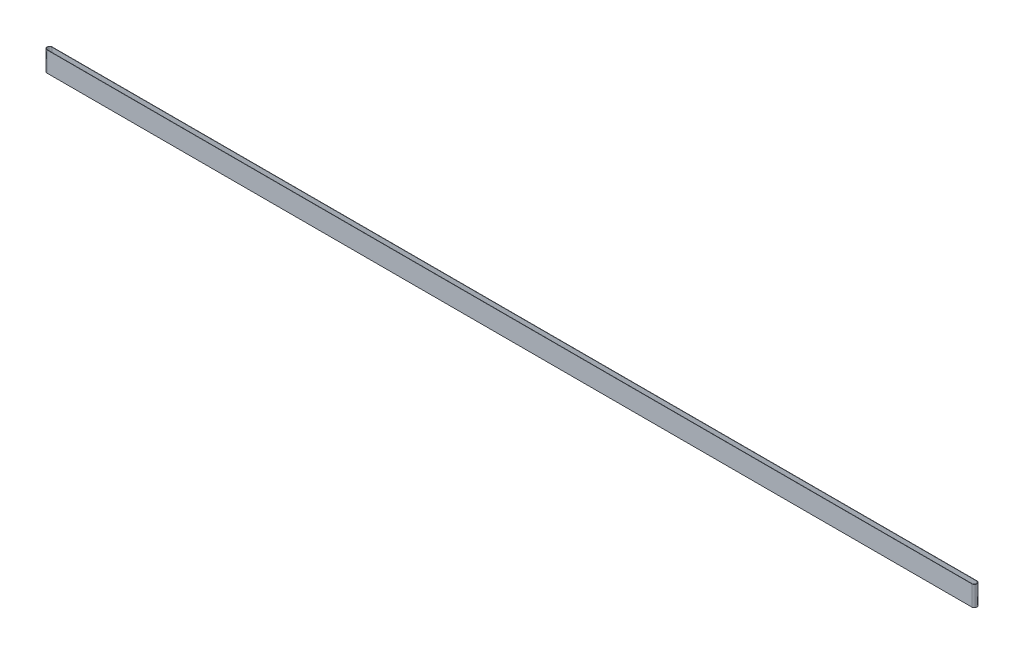
ISO-10303-21;
HEADER;
FILE_DESCRIPTION(('STEP AP214'),'2;1');
FILE_NAME('part.step','',(''),(''),'','','');
FILE_SCHEMA(('AUTOMOTIVE_DESIGN { 1 0 10303 214 1 1 1 1 }'));
ENDSEC;
DATA;
#1=APPLICATION_CONTEXT('core data for automotive mechanical design processes');
#2=APPLICATION_PROTOCOL_DEFINITION('international standard','automotive_design',2000,#1);
#3=PRODUCT_CONTEXT('',#1,'mechanical');
#4=PRODUCT('Part','Part','',(#3));
#5=PRODUCT_RELATED_PRODUCT_CATEGORY('part','',(#4));
#6=PRODUCT_DEFINITION_FORMATION('','',#4);
#7=PRODUCT_DEFINITION_CONTEXT('part definition',#1,'design');
#8=PRODUCT_DEFINITION('design','',#6,#7);
#9=PRODUCT_DEFINITION_SHAPE('','',#8);
#10=(LENGTH_UNIT() NAMED_UNIT(*) SI_UNIT(.MILLI.,.METRE.));
#11=(NAMED_UNIT(*) PLANE_ANGLE_UNIT() SI_UNIT($,.RADIAN.));
#12=(NAMED_UNIT(*) SI_UNIT($,.STERADIAN.) SOLID_ANGLE_UNIT());
#13=UNCERTAINTY_MEASURE_WITH_UNIT(LENGTH_MEASURE(1.E-05),#10,'distance_accuracy_value','');
#14=(GEOMETRIC_REPRESENTATION_CONTEXT(3) GLOBAL_UNCERTAINTY_ASSIGNED_CONTEXT((#13)) GLOBAL_UNIT_ASSIGNED_CONTEXT((#10,
#11,#12)) REPRESENTATION_CONTEXT('',''));
#15=CARTESIAN_POINT('',(0.,0.,0.));
#16=DIRECTION('',(0.,0.,1.));
#17=DIRECTION('',(1.,0.,0.));
#18=AXIS2_PLACEMENT_3D('',#15,#16,#17);
#19=CARTESIAN_POINT('',(0.,39.,0.));
#20=DIRECTION('',(0.,1.,0.));
#21=DIRECTION('',(0.,0.,1.));
#22=AXIS2_PLACEMENT_3D('',#19,#20,#21);
#23=PLANE('',#22);
#24=CARTESIAN_POINT('',(0.,39.,0.));
#25=DIRECTION('',(0.,1.,0.));
#26=DIRECTION('',(0.,0.,1.));
#27=AXIS2_PLACEMENT_3D('',#24,#25,#26);
#28=CIRCLE('',#27,5.);
#29=CARTESIAN_POINT('',(0.,39.,-5.));
#30=VERTEX_POINT('',#29);
#31=CARTESIAN_POINT('',(0.,39.,5.));
#32=VERTEX_POINT('',#31);
#33=EDGE_CURVE('E136',#30,#32,#28,.T.);
#34=ORIENTED_EDGE('',*,*,#33,.T.);
#35=DIRECTION('',(1.,0.,0.));
#36=VECTOR('',#35,1.);
#37=CARTESIAN_POINT('',(1790.,39.,4.99999999999982));
#38=LINE('',#37,#36);
#39=CARTESIAN_POINT('',(1790.,39.,4.99999999999982));
#40=VERTEX_POINT('',#39);
#41=EDGE_CURVE('E139',#32,#40,#38,.T.);
#42=ORIENTED_EDGE('',*,*,#41,.T.);
#43=CARTESIAN_POINT('',(1790.,39.,0.));
#44=DIRECTION('',(0.,1.,0.));
#45=DIRECTION('',(0.,0.,1.));
#46=AXIS2_PLACEMENT_3D('',#43,#44,#45);
#47=CIRCLE('',#46,4.99999999999982);
#48=CARTESIAN_POINT('',(1790.,39.,-4.99999999999982));
#49=VERTEX_POINT('',#48);
#50=EDGE_CURVE('E142',#40,#49,#47,.T.);
#51=ORIENTED_EDGE('',*,*,#50,.T.);
#52=DIRECTION('',(-1.,0.,0.));
#53=VECTOR('',#52,1.);
#54=CARTESIAN_POINT('',(0.,39.,-5.));
#55=LINE('',#54,#53);
#56=EDGE_CURVE('E144',#49,#30,#55,.T.);
#57=ORIENTED_EDGE('',*,*,#56,.T.);
#58=EDGE_LOOP('',(#34,#42,#51,#57));
#59=FACE_BOUND('',#58,.T.);
#60=DIRECTION('',(1.,0.,0.));
#61=VECTOR('',#60,1.);
#62=CARTESIAN_POINT('',(1790.,39.,4.50000000000001));
#63=LINE('',#62,#61);
#64=CARTESIAN_POINT('',(0.,39.,4.5));
#65=VERTEX_POINT('',#64);
#66=CARTESIAN_POINT('',(1790.,39.,4.50000000000001));
#67=VERTEX_POINT('',#66);
#68=EDGE_CURVE('E108',#65,#67,#63,.T.);
#69=ORIENTED_EDGE('',*,*,#68,.F.);
#70=CARTESIAN_POINT('',(0.,39.,0.));
#71=DIRECTION('',(0.,1.,0.));
#72=DIRECTION('',(0.,0.,1.));
#73=AXIS2_PLACEMENT_3D('',#70,#71,#72);
#74=CIRCLE('',#73,4.5);
#75=CARTESIAN_POINT('',(0.,39.,-4.5));
#76=VERTEX_POINT('',#75);
#77=EDGE_CURVE('E100',#76,#65,#74,.T.);
#78=ORIENTED_EDGE('',*,*,#77,.F.);
#79=DIRECTION('',(-1.,0.,0.));
#80=VECTOR('',#79,1.);
#81=CARTESIAN_POINT('',(0.,39.,-4.5));
#82=LINE('',#81,#80);
#83=CARTESIAN_POINT('',(1790.,39.,-4.50000000000001));
#84=VERTEX_POINT('',#83);
#85=EDGE_CURVE('E122',#84,#76,#82,.T.);
#86=ORIENTED_EDGE('',*,*,#85,.F.);
#87=CARTESIAN_POINT('',(1790.,39.,0.));
#88=DIRECTION('',(0.,1.,0.));
#89=DIRECTION('',(0.,0.,1.));
#90=AXIS2_PLACEMENT_3D('',#87,#88,#89);
#91=CIRCLE('',#90,4.50000000000001);
#92=EDGE_CURVE('E120',#67,#84,#91,.T.);
#93=ORIENTED_EDGE('',*,*,#92,.F.);
#94=EDGE_LOOP('',(#69,#78,#86,#93));
#95=FACE_BOUND('',#94,.T.);
#96=ADVANCED_FACE('F35',(#59,#95),#23,.T.);
#97=CARTESIAN_POINT('',(0.,0.,0.));
#98=DIRECTION('',(0.,1.,0.));
#99=DIRECTION('',(0.,0.,1.));
#100=AXIS2_PLACEMENT_3D('',#97,#98,#99);
#101=PLANE('',#100);
#102=CARTESIAN_POINT('',(0.,0.,0.));
#103=DIRECTION('',(0.,1.,0.));
#104=DIRECTION('',(0.,0.,1.));
#105=AXIS2_PLACEMENT_3D('',#102,#103,#104);
#106=CIRCLE('',#105,5.);
#107=CARTESIAN_POINT('',(0.,0.,-5.));
#108=VERTEX_POINT('',#107);
#109=CARTESIAN_POINT('',(0.,0.,5.));
#110=VERTEX_POINT('',#109);
#111=EDGE_CURVE('E116',#108,#110,#106,.T.);
#112=ORIENTED_EDGE('',*,*,#111,.F.);
#113=DIRECTION('',(-1.,0.,0.));
#114=VECTOR('',#113,1.);
#115=CARTESIAN_POINT('',(0.,0.,-5.));
#116=LINE('',#115,#114);
#117=CARTESIAN_POINT('',(1790.,0.,-4.99999999999982));
#118=VERTEX_POINT('',#117);
#119=EDGE_CURVE('E140',#118,#108,#116,.T.);
#120=ORIENTED_EDGE('',*,*,#119,.F.);
#121=CARTESIAN_POINT('',(1790.,0.,0.));
#122=DIRECTION('',(0.,1.,0.));
#123=DIRECTION('',(0.,0.,1.));
#124=AXIS2_PLACEMENT_3D('',#121,#122,#123);
#125=CIRCLE('',#124,4.99999999999982);
#126=CARTESIAN_POINT('',(1790.,0.,4.99999999999982));
#127=VERTEX_POINT('',#126);
#128=EDGE_CURVE('E151',#127,#118,#125,.T.);
#129=ORIENTED_EDGE('',*,*,#128,.F.);
#130=DIRECTION('',(1.,0.,0.));
#131=VECTOR('',#130,1.);
#132=CARTESIAN_POINT('',(1790.,0.,4.99999999999982));
#133=LINE('',#132,#131);
#134=EDGE_CURVE('E149',#110,#127,#133,.T.);
#135=ORIENTED_EDGE('',*,*,#134,.F.);
#136=EDGE_LOOP('',(#112,#120,#129,#135));
#137=FACE_BOUND('',#136,.T.);
#138=CARTESIAN_POINT('',(0.,0.,0.));
#139=DIRECTION('',(0.,1.,0.));
#140=DIRECTION('',(0.,0.,1.));
#141=AXIS2_PLACEMENT_3D('',#138,#139,#140);
#142=CIRCLE('',#141,4.5);
#143=CARTESIAN_POINT('',(0.,0.,-4.5));
#144=VERTEX_POINT('',#143);
#145=CARTESIAN_POINT('',(0.,0.,4.5));
#146=VERTEX_POINT('',#145);
#147=EDGE_CURVE('E58',#144,#146,#142,.T.);
#148=ORIENTED_EDGE('',*,*,#147,.T.);
#149=DIRECTION('',(1.,0.,0.));
#150=VECTOR('',#149,1.);
#151=CARTESIAN_POINT('',(1790.,0.,4.50000000000001));
#152=LINE('',#151,#150);
#153=CARTESIAN_POINT('',(1790.,0.,4.50000000000001));
#154=VERTEX_POINT('',#153);
#155=EDGE_CURVE('E115',#146,#154,#152,.T.);
#156=ORIENTED_EDGE('',*,*,#155,.T.);
#157=CARTESIAN_POINT('',(1790.,0.,0.));
#158=DIRECTION('',(0.,1.,0.));
#159=DIRECTION('',(0.,0.,1.));
#160=AXIS2_PLACEMENT_3D('',#157,#158,#159);
#161=CIRCLE('',#160,4.50000000000001);
#162=CARTESIAN_POINT('',(1790.,0.,-4.50000000000001));
#163=VERTEX_POINT('',#162);
#164=EDGE_CURVE('E128',#154,#163,#161,.T.);
#165=ORIENTED_EDGE('',*,*,#164,.T.);
#166=DIRECTION('',(-1.,0.,0.));
#167=VECTOR('',#166,1.);
#168=CARTESIAN_POINT('',(0.,0.,-4.5));
#169=LINE('',#168,#167);
#170=EDGE_CURVE('E109',#163,#144,#169,.T.);
#171=ORIENTED_EDGE('',*,*,#170,.T.);
#172=EDGE_LOOP('',(#148,#156,#165,#171));
#173=FACE_BOUND('',#172,.T.);
#174=ADVANCED_FACE('F169',(#137,#173),#101,.F.);
#175=CARTESIAN_POINT('',(0.,39.,0.));
#176=DIRECTION('',(0.,-1.,0.));
#177=DIRECTION('',(0.,0.,-1.));
#178=AXIS2_PLACEMENT_3D('',#175,#176,#177);
#179=CYLINDRICAL_SURFACE('',#178,5.);
#180=ORIENTED_EDGE('',*,*,#111,.T.);
#181=DIRECTION('',(0.,-1.,0.));
#182=VECTOR('',#181,1.);
#183=CARTESIAN_POINT('',(0.,39.,5.));
#184=LINE('',#183,#182);
#185=EDGE_CURVE('E11',#32,#110,#184,.T.);
#186=ORIENTED_EDGE('',*,*,#185,.F.);
#187=ORIENTED_EDGE('',*,*,#33,.F.);
#188=DIRECTION('',(0.,-1.,0.));
#189=VECTOR('',#188,1.);
#190=CARTESIAN_POINT('',(0.,39.,-5.));
#191=LINE('',#190,#189);
#192=EDGE_CURVE('E146',#30,#108,#191,.T.);
#193=ORIENTED_EDGE('',*,*,#192,.T.);
#194=EDGE_LOOP('',(#180,#186,#187,#193));
#195=FACE_BOUND('',#194,.T.);
#196=ADVANCED_FACE('F37',(#195),#179,.T.);
#197=CARTESIAN_POINT('',(1790.,39.,4.99999999999982));
#198=DIRECTION('',(0.,0.,-1.));
#199=DIRECTION('',(-1.,0.,0.));
#200=AXIS2_PLACEMENT_3D('',#197,#198,#199);
#201=PLANE('',#200);
#202=ORIENTED_EDGE('',*,*,#134,.T.);
#203=DIRECTION('',(0.,-1.,0.));
#204=VECTOR('',#203,1.);
#205=CARTESIAN_POINT('',(1790.,39.,4.99999999999982));
#206=LINE('',#205,#204);
#207=EDGE_CURVE('E43',#40,#127,#206,.T.);
#208=ORIENTED_EDGE('',*,*,#207,.F.);
#209=ORIENTED_EDGE('',*,*,#41,.F.);
#210=ORIENTED_EDGE('',*,*,#185,.T.);
#211=EDGE_LOOP('',(#202,#208,#209,#210));
#212=FACE_BOUND('',#211,.T.);
#213=ADVANCED_FACE('F179',(#212),#201,.F.);
#214=CARTESIAN_POINT('',(1790.,39.,0.));
#215=DIRECTION('',(0.,-1.,0.));
#216=DIRECTION('',(0.,0.,-1.));
#217=AXIS2_PLACEMENT_3D('',#214,#215,#216);
#218=CYLINDRICAL_SURFACE('',#217,4.99999999999982);
#219=ORIENTED_EDGE('',*,*,#128,.T.);
#220=DIRECTION('',(0.,-1.,0.));
#221=VECTOR('',#220,1.);
#222=CARTESIAN_POINT('',(1790.,39.,-4.99999999999982));
#223=LINE('',#222,#221);
#224=EDGE_CURVE('E156',#49,#118,#223,.T.);
#225=ORIENTED_EDGE('',*,*,#224,.F.);
#226=ORIENTED_EDGE('',*,*,#50,.F.);
#227=ORIENTED_EDGE('',*,*,#207,.T.);
#228=EDGE_LOOP('',(#219,#225,#226,#227));
#229=FACE_BOUND('',#228,.T.);
#230=ADVANCED_FACE('F163',(#229),#218,.T.);
#231=CARTESIAN_POINT('',(0.,39.,-5.));
#232=DIRECTION('',(0.,0.,1.));
#233=DIRECTION('',(1.,0.,0.));
#234=AXIS2_PLACEMENT_3D('',#231,#232,#233);
#235=PLANE('',#234);
#236=ORIENTED_EDGE('',*,*,#119,.T.);
#237=ORIENTED_EDGE('',*,*,#192,.F.);
#238=ORIENTED_EDGE('',*,*,#56,.F.);
#239=ORIENTED_EDGE('',*,*,#224,.T.);
#240=EDGE_LOOP('',(#236,#237,#238,#239));
#241=FACE_BOUND('',#240,.T.);
#242=ADVANCED_FACE('F173',(#241),#235,.F.);
#243=CARTESIAN_POINT('',(0.,39.,0.));
#244=DIRECTION('',(0.,-1.,0.));
#245=DIRECTION('',(0.,0.,-1.));
#246=AXIS2_PLACEMENT_3D('',#243,#244,#245);
#247=CYLINDRICAL_SURFACE('',#246,4.5);
#248=ORIENTED_EDGE('',*,*,#147,.F.);
#249=DIRECTION('',(0.,-1.,0.));
#250=VECTOR('',#249,1.);
#251=CARTESIAN_POINT('',(0.,39.,-4.5));
#252=LINE('',#251,#250);
#253=EDGE_CURVE('E104',#76,#144,#252,.T.);
#254=ORIENTED_EDGE('',*,*,#253,.F.);
#255=ORIENTED_EDGE('',*,*,#77,.T.);
#256=DIRECTION('',(0.,-1.,0.));
#257=VECTOR('',#256,1.);
#258=CARTESIAN_POINT('',(0.,39.,4.5));
#259=LINE('',#258,#257);
#260=EDGE_CURVE('E103',#65,#146,#259,.T.);
#261=ORIENTED_EDGE('',*,*,#260,.T.);
#262=EDGE_LOOP('',(#248,#254,#255,#261));
#263=FACE_BOUND('',#262,.T.);
#264=ADVANCED_FACE('F102',(#263),#247,.F.);
#265=CARTESIAN_POINT('',(1790.,39.,4.50000000000001));
#266=DIRECTION('',(0.,0.,-1.));
#267=DIRECTION('',(-1.,0.,0.));
#268=AXIS2_PLACEMENT_3D('',#265,#266,#267);
#269=PLANE('',#268);
#270=ORIENTED_EDGE('',*,*,#155,.F.);
#271=ORIENTED_EDGE('',*,*,#260,.F.);
#272=ORIENTED_EDGE('',*,*,#68,.T.);
#273=DIRECTION('',(0.,-1.,0.));
#274=VECTOR('',#273,1.);
#275=CARTESIAN_POINT('',(1790.,39.,4.50000000000001));
#276=LINE('',#275,#274);
#277=EDGE_CURVE('E117',#67,#154,#276,.T.);
#278=ORIENTED_EDGE('',*,*,#277,.T.);
#279=EDGE_LOOP('',(#270,#271,#272,#278));
#280=FACE_BOUND('',#279,.T.);
#281=ADVANCED_FACE('F112',(#280),#269,.T.);
#282=CARTESIAN_POINT('',(1790.,39.,0.));
#283=DIRECTION('',(0.,-1.,0.));
#284=DIRECTION('',(0.,0.,-1.));
#285=AXIS2_PLACEMENT_3D('',#282,#283,#284);
#286=CYLINDRICAL_SURFACE('',#285,4.50000000000001);
#287=ORIENTED_EDGE('',*,*,#164,.F.);
#288=ORIENTED_EDGE('',*,*,#277,.F.);
#289=ORIENTED_EDGE('',*,*,#92,.T.);
#290=DIRECTION('',(0.,-1.,0.));
#291=VECTOR('',#290,1.);
#292=CARTESIAN_POINT('',(1790.,39.,-4.50000000000001));
#293=LINE('',#292,#291);
#294=EDGE_CURVE('E50',#84,#163,#293,.T.);
#295=ORIENTED_EDGE('',*,*,#294,.T.);
#296=EDGE_LOOP('',(#287,#288,#289,#295));
#297=FACE_BOUND('',#296,.T.);
#298=ADVANCED_FACE('F202',(#297),#286,.F.);
#299=CARTESIAN_POINT('',(0.,39.,-4.5));
#300=DIRECTION('',(0.,0.,1.));
#301=DIRECTION('',(1.,0.,0.));
#302=AXIS2_PLACEMENT_3D('',#299,#300,#301);
#303=PLANE('',#302);
#304=ORIENTED_EDGE('',*,*,#170,.F.);
#305=ORIENTED_EDGE('',*,*,#294,.F.);
#306=ORIENTED_EDGE('',*,*,#85,.T.);
#307=ORIENTED_EDGE('',*,*,#253,.T.);
#308=EDGE_LOOP('',(#304,#305,#306,#307));
#309=FACE_BOUND('',#308,.T.);
#310=ADVANCED_FACE('F206',(#309),#303,.T.);
#311=CLOSED_SHELL('',(#96,#174,#196,#213,#230,#242,#264,#281,#298,#310));
#312=MANIFOLD_SOLID_BREP('B2',#311);
#313=ADVANCED_BREP_SHAPE_REPRESENTATION('',(#18,#312),#14);
#314=SHAPE_DEFINITION_REPRESENTATION(#9,#313);
ENDSEC;
END-ISO-10303-21;
